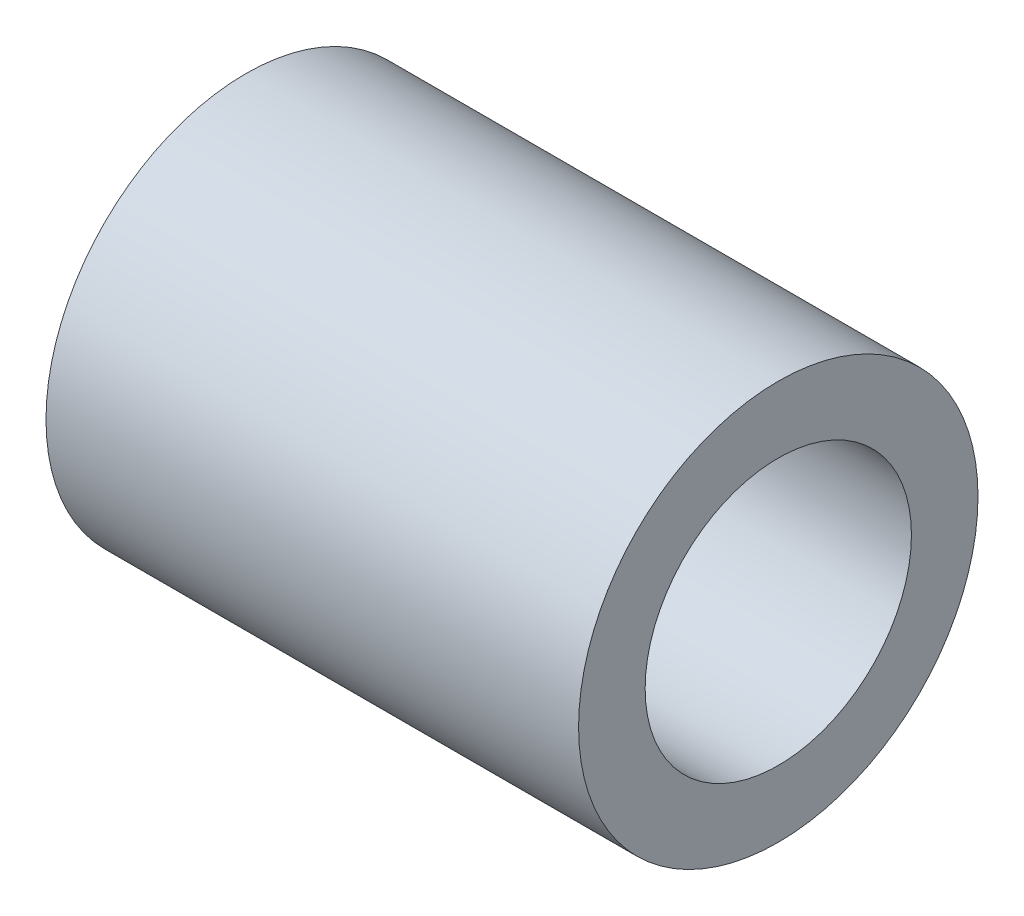
ISO-10303-21;
HEADER;
FILE_DESCRIPTION(('STEP AP214'),'2;1');
FILE_NAME('part.step','',(''),(''),'','','');
FILE_SCHEMA(('AUTOMOTIVE_DESIGN { 1 0 10303 214 1 1 1 1 }'));
ENDSEC;
DATA;
#1=APPLICATION_CONTEXT('core data for automotive mechanical design processes');
#2=APPLICATION_PROTOCOL_DEFINITION('international standard','automotive_design',2000,#1);
#3=PRODUCT_CONTEXT('',#1,'mechanical');
#4=PRODUCT('Part','Part','',(#3));
#5=PRODUCT_RELATED_PRODUCT_CATEGORY('part','',(#4));
#6=PRODUCT_DEFINITION_FORMATION('','',#4);
#7=PRODUCT_DEFINITION_CONTEXT('part definition',#1,'design');
#8=PRODUCT_DEFINITION('design','',#6,#7);
#9=PRODUCT_DEFINITION_SHAPE('','',#8);
#10=(LENGTH_UNIT() NAMED_UNIT(*) SI_UNIT(.MILLI.,.METRE.));
#11=(NAMED_UNIT(*) PLANE_ANGLE_UNIT() SI_UNIT($,.RADIAN.));
#12=(NAMED_UNIT(*) SI_UNIT($,.STERADIAN.) SOLID_ANGLE_UNIT());
#13=UNCERTAINTY_MEASURE_WITH_UNIT(LENGTH_MEASURE(1.E-05),#10,'distance_accuracy_value','');
#14=(GEOMETRIC_REPRESENTATION_CONTEXT(3) GLOBAL_UNCERTAINTY_ASSIGNED_CONTEXT((#13)) GLOBAL_UNIT_ASSIGNED_CONTEXT((#10,
#11,#12)) REPRESENTATION_CONTEXT('',''));
#15=CARTESIAN_POINT('',(0.,0.,0.));
#16=DIRECTION('',(0.,0.,1.));
#17=DIRECTION('',(1.,0.,0.));
#18=AXIS2_PLACEMENT_3D('',#15,#16,#17);
#19=CARTESIAN_POINT('',(40.,0.,0.));
#20=DIRECTION('',(-1.,0.,0.));
#21=DIRECTION('',(0.,0.,1.));
#22=AXIS2_PLACEMENT_3D('',#19,#20,#21);
#23=CYLINDRICAL_SURFACE('',#22,20.);
#24=CARTESIAN_POINT('',(40.,0.,0.));
#25=DIRECTION('',(1.,0.,0.));
#26=DIRECTION('',(0.,0.,-1.));
#27=AXIS2_PLACEMENT_3D('',#24,#25,#26);
#28=CIRCLE('',#27,20.);
#29=CARTESIAN_POINT('',(40.,0.,-20.));
#30=VERTEX_POINT('',#29);
#31=EDGE_CURVE('E49',#30,#30,#28,.T.);
#32=ORIENTED_EDGE('',*,*,#31,.T.);
#33=EDGE_LOOP('',(#32));
#34=FACE_BOUND('',#33,.T.);
#35=CARTESIAN_POINT('',(-40.,0.,0.));
#36=DIRECTION('',(1.,0.,0.));
#37=DIRECTION('',(0.,0.,-1.));
#38=AXIS2_PLACEMENT_3D('',#35,#36,#37);
#39=CIRCLE('',#38,20.);
#40=CARTESIAN_POINT('',(-40.,0.,-20.));
#41=VERTEX_POINT('',#40);
#42=EDGE_CURVE('E56',#41,#41,#39,.T.);
#43=ORIENTED_EDGE('',*,*,#42,.F.);
#44=EDGE_LOOP('',(#43));
#45=FACE_BOUND('',#44,.T.);
#46=ADVANCED_FACE('F41',(#34,#45),#23,.F.);
#47=CARTESIAN_POINT('',(40.,0.,0.));
#48=DIRECTION('',(-1.,0.,0.));
#49=DIRECTION('',(0.,0.,1.));
#50=AXIS2_PLACEMENT_3D('',#47,#48,#49);
#51=CYLINDRICAL_SURFACE('',#50,30.);
#52=CARTESIAN_POINT('',(40.,0.,0.));
#53=DIRECTION('',(1.,0.,0.));
#54=DIRECTION('',(0.,0.,-1.));
#55=AXIS2_PLACEMENT_3D('',#52,#53,#54);
#56=CIRCLE('',#55,30.);
#57=CARTESIAN_POINT('',(40.,0.,-30.));
#58=VERTEX_POINT('',#57);
#59=EDGE_CURVE('E10',#58,#58,#56,.T.);
#60=ORIENTED_EDGE('',*,*,#59,.F.);
#61=EDGE_LOOP('',(#60));
#62=FACE_BOUND('',#61,.T.);
#63=CARTESIAN_POINT('',(-40.,0.,0.));
#64=DIRECTION('',(1.,0.,0.));
#65=DIRECTION('',(0.,0.,-1.));
#66=AXIS2_PLACEMENT_3D('',#63,#64,#65);
#67=CIRCLE('',#66,30.);
#68=CARTESIAN_POINT('',(-40.,0.,-30.));
#69=VERTEX_POINT('',#68);
#70=EDGE_CURVE('E44',#69,#69,#67,.T.);
#71=ORIENTED_EDGE('',*,*,#70,.T.);
#72=EDGE_LOOP('',(#71));
#73=FACE_BOUND('',#72,.T.);
#74=ADVANCED_FACE('F65',(#62,#73),#51,.T.);
#75=CARTESIAN_POINT('',(40.,0.,0.));
#76=DIRECTION('',(1.,0.,0.));
#77=DIRECTION('',(0.,0.,-1.));
#78=AXIS2_PLACEMENT_3D('',#75,#76,#77);
#79=PLANE('',#78);
#80=ORIENTED_EDGE('',*,*,#31,.F.);
#81=EDGE_LOOP('',(#80));
#82=FACE_BOUND('',#81,.T.);
#83=ORIENTED_EDGE('',*,*,#59,.T.);
#84=EDGE_LOOP('',(#83));
#85=FACE_BOUND('',#84,.T.);
#86=ADVANCED_FACE('F69',(#82,#85),#79,.T.);
#87=CARTESIAN_POINT('',(-40.,0.,0.));
#88=DIRECTION('',(1.,0.,0.));
#89=DIRECTION('',(0.,0.,-1.));
#90=AXIS2_PLACEMENT_3D('',#87,#88,#89);
#91=PLANE('',#90);
#92=ORIENTED_EDGE('',*,*,#42,.T.);
#93=EDGE_LOOP('',(#92));
#94=FACE_BOUND('',#93,.T.);
#95=ORIENTED_EDGE('',*,*,#70,.F.);
#96=EDGE_LOOP('',(#95));
#97=FACE_BOUND('',#96,.T.);
#98=ADVANCED_FACE('F67',(#94,#97),#91,.F.);
#99=CLOSED_SHELL('',(#46,#74,#86,#98));
#100=MANIFOLD_SOLID_BREP('B2',#99);
#101=ADVANCED_BREP_SHAPE_REPRESENTATION('',(#18,#100),#14);
#102=SHAPE_DEFINITION_REPRESENTATION(#9,#101);
ENDSEC;
END-ISO-10303-21;
